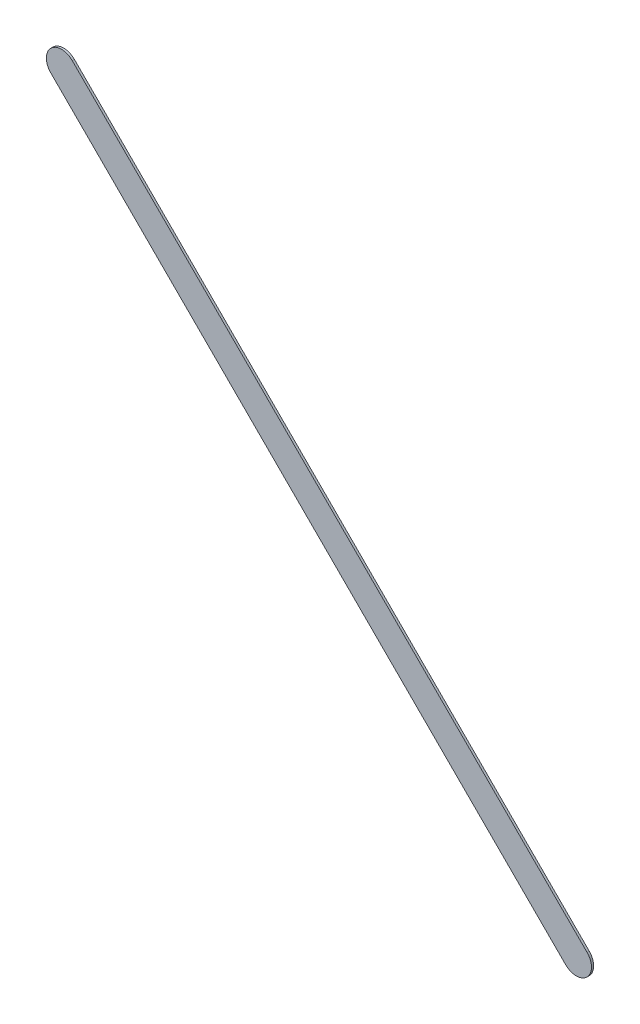
ISO-10303-21;
HEADER;
FILE_DESCRIPTION(('STEP AP214'),'2;1');
FILE_NAME('part.step','',(''),(''),'','','');
FILE_SCHEMA(('AUTOMOTIVE_DESIGN { 1 0 10303 214 1 1 1 1 }'));
ENDSEC;
DATA;
#1=APPLICATION_CONTEXT('core data for automotive mechanical design processes');
#2=APPLICATION_PROTOCOL_DEFINITION('international standard','automotive_design',2000,#1);
#3=PRODUCT_CONTEXT('',#1,'mechanical');
#4=PRODUCT('Part','Part','',(#3));
#5=PRODUCT_RELATED_PRODUCT_CATEGORY('part','',(#4));
#6=PRODUCT_DEFINITION_FORMATION('','',#4);
#7=PRODUCT_DEFINITION_CONTEXT('part definition',#1,'design');
#8=PRODUCT_DEFINITION('design','',#6,#7);
#9=PRODUCT_DEFINITION_SHAPE('','',#8);
#10=(LENGTH_UNIT() NAMED_UNIT(*) SI_UNIT(.MILLI.,.METRE.));
#11=(NAMED_UNIT(*) PLANE_ANGLE_UNIT() SI_UNIT($,.RADIAN.));
#12=(NAMED_UNIT(*) SI_UNIT($,.STERADIAN.) SOLID_ANGLE_UNIT());
#13=UNCERTAINTY_MEASURE_WITH_UNIT(LENGTH_MEASURE(1.E-05),#10,'distance_accuracy_value','');
#14=(GEOMETRIC_REPRESENTATION_CONTEXT(3) GLOBAL_UNCERTAINTY_ASSIGNED_CONTEXT((#13)) GLOBAL_UNIT_ASSIGNED_CONTEXT((#10,
#11,#12)) REPRESENTATION_CONTEXT('',''));
#15=CARTESIAN_POINT('',(0.,0.,0.));
#16=DIRECTION('',(0.,0.,1.));
#17=DIRECTION('',(1.,0.,0.));
#18=AXIS2_PLACEMENT_3D('',#15,#16,#17);
#19=CARTESIAN_POINT('',(76.7232273,76.32322556,0.));
#20=DIRECTION('',(0.707106781186548,0.707106781186548,0.));
#21=DIRECTION('',(0.707106781186548,-0.707106781186548,0.));
#22=AXIS2_PLACEMENT_3D('',#19,#20,#21);
#23=PLANE('',#22);
#24=DIRECTION('',(0.707106781186548,-0.707106781186548,0.));
#25=VECTOR('',#24,1.);
#26=CARTESIAN_POINT('',(76.7232273,76.32322556,0.03556));
#27=LINE('',#26,#25);
#28=CARTESIAN_POINT('',(76.7232273,76.32322556,0.03556));
#29=VERTEX_POINT('',#28);
#30=CARTESIAN_POINT('',(85.22322554,67.82322732,0.03556));
#31=VERTEX_POINT('',#30);
#32=EDGE_CURVE('E11',#29,#31,#27,.T.);
#33=ORIENTED_EDGE('',*,*,#32,.F.);
#34=DIRECTION('',(0.,0.,1.));
#35=VECTOR('',#34,1.);
#36=CARTESIAN_POINT('',(76.7232273,76.32322556,0.));
#37=LINE('',#36,#35);
#38=CARTESIAN_POINT('',(76.7232273,76.32322556,0.));
#39=VERTEX_POINT('',#38);
#40=EDGE_CURVE('E24',#39,#29,#37,.T.);
#41=ORIENTED_EDGE('',*,*,#40,.F.);
#42=DIRECTION('',(0.707106781186548,-0.707106781186548,0.));
#43=VECTOR('',#42,1.);
#44=CARTESIAN_POINT('',(76.7232273,76.32322556,0.));
#45=LINE('',#44,#43);
#46=CARTESIAN_POINT('',(85.22322554,67.82322732,0.));
#47=VERTEX_POINT('',#46);
#48=EDGE_CURVE('E75',#39,#47,#45,.T.);
#49=ORIENTED_EDGE('',*,*,#48,.T.);
#50=DIRECTION('',(0.,0.,1.));
#51=VECTOR('',#50,1.);
#52=CARTESIAN_POINT('',(85.22322554,67.82322732,0.));
#53=LINE('',#52,#51);
#54=EDGE_CURVE('E37',#47,#31,#53,.T.);
#55=ORIENTED_EDGE('',*,*,#54,.T.);
#56=EDGE_LOOP('',(#33,#41,#49,#55));
#57=FACE_BOUND('',#56,.T.);
#58=ADVANCED_FACE('F17',(#57),#23,.F.);
#59=CARTESIAN_POINT('',(85.40000192,68.0000037,0.));
#60=DIRECTION('',(0.,0.,-1.));
#61=DIRECTION('',(-0.707106781186548,-0.707106781186548,0.));
#62=AXIS2_PLACEMENT_3D('',#59,#60,#61);
#63=CYLINDRICAL_SURFACE('',#62,0.249999554103226);
#64=CARTESIAN_POINT('',(85.40000192,68.0000037,0.03556));
#65=DIRECTION('',(0.,0.,1.));
#66=DIRECTION('',(-0.707106781186548,-0.707106781186548,0.));
#67=AXIS2_PLACEMENT_3D('',#64,#65,#66);
#68=CIRCLE('',#67,0.249999554103226);
#69=CARTESIAN_POINT('',(85.5767783,68.17678008,0.03556));
#70=VERTEX_POINT('',#69);
#71=EDGE_CURVE('E83',#31,#70,#68,.T.);
#72=ORIENTED_EDGE('',*,*,#71,.F.);
#73=ORIENTED_EDGE('',*,*,#54,.F.);
#74=CARTESIAN_POINT('',(85.40000192,68.0000037,0.));
#75=DIRECTION('',(0.,0.,1.));
#76=DIRECTION('',(-0.707106781186548,-0.707106781186548,0.));
#77=AXIS2_PLACEMENT_3D('',#74,#75,#76);
#78=CIRCLE('',#77,0.249999554103226);
#79=CARTESIAN_POINT('',(85.5767783,68.17678008,0.));
#80=VERTEX_POINT('',#79);
#81=EDGE_CURVE('E81',#47,#80,#78,.T.);
#82=ORIENTED_EDGE('',*,*,#81,.T.);
#83=DIRECTION('',(0.,0.,1.));
#84=VECTOR('',#83,1.);
#85=CARTESIAN_POINT('',(85.5767783,68.17678008,0.));
#86=LINE('',#85,#84);
#87=EDGE_CURVE('E67',#80,#70,#86,.T.);
#88=ORIENTED_EDGE('',*,*,#87,.T.);
#89=EDGE_LOOP('',(#72,#73,#82,#88));
#90=FACE_BOUND('',#89,.T.);
#91=ADVANCED_FACE('F89',(#90),#63,.T.);
#92=CARTESIAN_POINT('',(85.5767783,68.17678008,0.));
#93=DIRECTION('',(-0.707106781186547,-0.707106781186548,0.));
#94=DIRECTION('',(-0.707106781186548,0.707106781186547,0.));
#95=AXIS2_PLACEMENT_3D('',#92,#93,#94);
#96=PLANE('',#95);
#97=DIRECTION('',(-0.707106781186548,0.707106781186547,0.));
#98=VECTOR('',#97,1.);
#99=CARTESIAN_POINT('',(85.5767783,68.17678008,0.03556));
#100=LINE('',#99,#98);
#101=CARTESIAN_POINT('',(77.07678006,76.67677832,0.03556));
#102=VERTEX_POINT('',#101);
#103=EDGE_CURVE('E71',#70,#102,#100,.T.);
#104=ORIENTED_EDGE('',*,*,#103,.F.);
#105=ORIENTED_EDGE('',*,*,#87,.F.);
#106=DIRECTION('',(-0.707106781186548,0.707106781186547,0.));
#107=VECTOR('',#106,1.);
#108=CARTESIAN_POINT('',(85.5767783,68.17678008,0.));
#109=LINE('',#108,#107);
#110=CARTESIAN_POINT('',(77.07678006,76.67677832,0.));
#111=VERTEX_POINT('',#110);
#112=EDGE_CURVE('E63',#80,#111,#109,.T.);
#113=ORIENTED_EDGE('',*,*,#112,.T.);
#114=DIRECTION('',(0.,0.,1.));
#115=VECTOR('',#114,1.);
#116=CARTESIAN_POINT('',(77.07678006,76.67677832,0.));
#117=LINE('',#116,#115);
#118=EDGE_CURVE('E53',#111,#102,#117,.T.);
#119=ORIENTED_EDGE('',*,*,#118,.T.);
#120=EDGE_LOOP('',(#104,#105,#113,#119));
#121=FACE_BOUND('',#120,.T.);
#122=ADVANCED_FACE('F66',(#121),#96,.F.);
#123=CARTESIAN_POINT('',(76.90000368,76.50000194,0.));
#124=DIRECTION('',(0.,0.,-1.));
#125=DIRECTION('',(0.707106781186548,0.707106781186548,0.));
#126=AXIS2_PLACEMENT_3D('',#123,#124,#125);
#127=CYLINDRICAL_SURFACE('',#126,0.24999955410322);
#128=CARTESIAN_POINT('',(76.90000368,76.50000194,0.03556));
#129=DIRECTION('',(0.,0.,1.));
#130=DIRECTION('',(0.707106781186548,0.707106781186548,0.));
#131=AXIS2_PLACEMENT_3D('',#128,#129,#130);
#132=CIRCLE('',#131,0.24999955410322);
#133=EDGE_CURVE('E59',#102,#29,#132,.T.);
#134=ORIENTED_EDGE('',*,*,#133,.F.);
#135=ORIENTED_EDGE('',*,*,#118,.F.);
#136=CARTESIAN_POINT('',(76.90000368,76.50000194,0.));
#137=DIRECTION('',(0.,0.,1.));
#138=DIRECTION('',(0.707106781186548,0.707106781186548,0.));
#139=AXIS2_PLACEMENT_3D('',#136,#137,#138);
#140=CIRCLE('',#139,0.24999955410322);
#141=EDGE_CURVE('E57',#111,#39,#140,.T.);
#142=ORIENTED_EDGE('',*,*,#141,.T.);
#143=ORIENTED_EDGE('',*,*,#40,.T.);
#144=EDGE_LOOP('',(#134,#135,#142,#143));
#145=FACE_BOUND('',#144,.T.);
#146=ADVANCED_FACE('F55',(#145),#127,.T.);
#147=CARTESIAN_POINT('',(76.7232273,76.32322556,0.));
#148=DIRECTION('',(0.,0.,-1.));
#149=DIRECTION('',(-1.,0.,0.));
#150=AXIS2_PLACEMENT_3D('',#147,#148,#149);
#151=PLANE('',#150);
#152=ORIENTED_EDGE('',*,*,#141,.F.);
#153=ORIENTED_EDGE('',*,*,#112,.F.);
#154=ORIENTED_EDGE('',*,*,#81,.F.);
#155=ORIENTED_EDGE('',*,*,#48,.F.);
#156=EDGE_LOOP('',(#152,#153,#154,#155));
#157=FACE_BOUND('',#156,.T.);
#158=ADVANCED_FACE('F74',(#157),#151,.T.);
#159=CARTESIAN_POINT('',(76.7232273,76.32322556,0.03556));
#160=DIRECTION('',(0.,0.,-1.));
#161=DIRECTION('',(-1.,0.,0.));
#162=AXIS2_PLACEMENT_3D('',#159,#160,#161);
#163=PLANE('',#162);
#164=ORIENTED_EDGE('',*,*,#32,.T.);
#165=ORIENTED_EDGE('',*,*,#71,.T.);
#166=ORIENTED_EDGE('',*,*,#103,.T.);
#167=ORIENTED_EDGE('',*,*,#133,.T.);
#168=EDGE_LOOP('',(#164,#165,#166,#167));
#169=FACE_BOUND('',#168,.T.);
#170=ADVANCED_FACE('F91',(#169),#163,.F.);
#171=CLOSED_SHELL('',(#58,#91,#122,#146,#158,#170));
#172=MANIFOLD_SOLID_BREP('B1',#171);
#173=ADVANCED_BREP_SHAPE_REPRESENTATION('',(#18,#172),#14);
#174=SHAPE_DEFINITION_REPRESENTATION(#9,#173);
ENDSEC;
END-ISO-10303-21;
